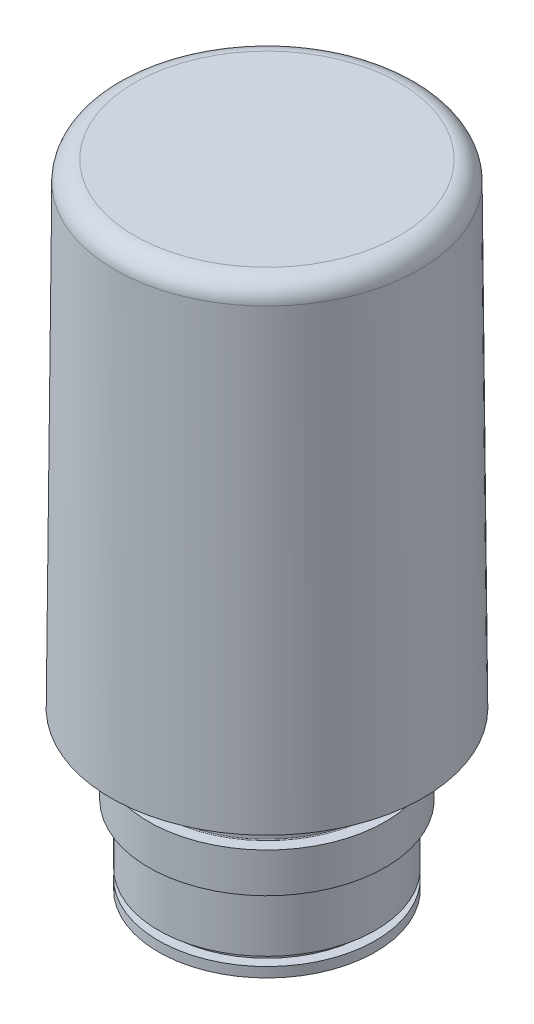
ISO-10303-21;
HEADER;
FILE_DESCRIPTION(('STEP AP214'),'2;1');
FILE_NAME('part.step','',(''),(''),'','','');
FILE_SCHEMA(('AUTOMOTIVE_DESIGN { 1 0 10303 214 1 1 1 1 }'));
ENDSEC;
DATA;
#1=APPLICATION_CONTEXT('core data for automotive mechanical design processes');
#2=APPLICATION_PROTOCOL_DEFINITION('international standard','automotive_design',2000,#1);
#3=PRODUCT_CONTEXT('',#1,'mechanical');
#4=PRODUCT('Part','Part','',(#3));
#5=PRODUCT_RELATED_PRODUCT_CATEGORY('part','',(#4));
#6=PRODUCT_DEFINITION_FORMATION('','',#4);
#7=PRODUCT_DEFINITION_CONTEXT('part definition',#1,'design');
#8=PRODUCT_DEFINITION('design','',#6,#7);
#9=PRODUCT_DEFINITION_SHAPE('','',#8);
#10=(LENGTH_UNIT() NAMED_UNIT(*) SI_UNIT(.MILLI.,.METRE.));
#11=(NAMED_UNIT(*) PLANE_ANGLE_UNIT() SI_UNIT($,.RADIAN.));
#12=(NAMED_UNIT(*) SI_UNIT($,.STERADIAN.) SOLID_ANGLE_UNIT());
#13=UNCERTAINTY_MEASURE_WITH_UNIT(LENGTH_MEASURE(1.E-05),#10,'distance_accuracy_value','');
#14=(GEOMETRIC_REPRESENTATION_CONTEXT(3) GLOBAL_UNCERTAINTY_ASSIGNED_CONTEXT((#13)) GLOBAL_UNIT_ASSIGNED_CONTEXT((#10,
#11,#12)) REPRESENTATION_CONTEXT('',''));
#15=CARTESIAN_POINT('',(0.,0.,0.));
#16=DIRECTION('',(0.,0.,1.));
#17=DIRECTION('',(1.,0.,0.));
#18=AXIS2_PLACEMENT_3D('',#15,#16,#17);
#19=CARTESIAN_POINT('',(0.,0.,0.));
#20=DIRECTION('',(0.,-1.,0.));
#21=DIRECTION('',(0.,0.,-1.));
#22=AXIS2_PLACEMENT_3D('',#19,#20,#21);
#23=CYLINDRICAL_SURFACE('',#22,13.97);
#24=CARTESIAN_POINT('',(0.,36.6349026,0.));
#25=DIRECTION('',(0.,-1.,0.));
#26=DIRECTION('',(0.,0.,-1.));
#27=AXIS2_PLACEMENT_3D('',#24,#25,#26);
#28=CIRCLE('',#27,13.97);
#29=CARTESIAN_POINT('',(0.,36.6349026,-13.97));
#30=VERTEX_POINT('',#29);
#31=EDGE_CURVE('E126',#30,#30,#28,.T.);
#32=ORIENTED_EDGE('',*,*,#31,.F.);
#33=EDGE_LOOP('',(#32));
#34=FACE_BOUND('',#33,.T.);
#35=CARTESIAN_POINT('',(0.,0.,0.));
#36=DIRECTION('',(0.,-1.,0.));
#37=DIRECTION('',(0.,0.,-1.));
#38=AXIS2_PLACEMENT_3D('',#35,#36,#37);
#39=CIRCLE('',#38,13.97);
#40=CARTESIAN_POINT('',(0.,0.,-13.97));
#41=VERTEX_POINT('',#40);
#42=EDGE_CURVE('E69',#41,#41,#39,.T.);
#43=ORIENTED_EDGE('',*,*,#42,.T.);
#44=EDGE_LOOP('',(#43));
#45=FACE_BOUND('',#44,.T.);
#46=ADVANCED_FACE('F37',(#34,#45),#23,.F.);
#47=CARTESIAN_POINT('',(-13.97,0.,0.));
#48=DIRECTION('',(0.,1.,0.));
#49=DIRECTION('',(0.,0.,1.));
#50=AXIS2_PLACEMENT_3D('',#47,#48,#49);
#51=PLANE('',#50);
#52=ORIENTED_EDGE('',*,*,#42,.F.);
#53=EDGE_LOOP('',(#52));
#54=FACE_BOUND('',#53,.T.);
#55=CARTESIAN_POINT('',(0.,0.,0.));
#56=DIRECTION('',(0.,-1.,0.));
#57=DIRECTION('',(0.,0.,-1.));
#58=AXIS2_PLACEMENT_3D('',#55,#56,#57);
#59=CIRCLE('',#58,17.399);
#60=CARTESIAN_POINT('',(0.,0.,-17.399));
#61=VERTEX_POINT('',#60);
#62=EDGE_CURVE('E72',#61,#61,#59,.T.);
#63=ORIENTED_EDGE('',*,*,#62,.T.);
#64=EDGE_LOOP('',(#63));
#65=FACE_BOUND('',#64,.T.);
#66=ADVANCED_FACE('F156',(#54,#65),#51,.F.);
#67=CARTESIAN_POINT('',(0.,0.,0.));
#68=DIRECTION('',(0.,-1.,0.));
#69=DIRECTION('',(0.,0.,-1.));
#70=AXIS2_PLACEMENT_3D('',#67,#68,#69);
#71=CYLINDRICAL_SURFACE('',#70,17.399);
#72=ORIENTED_EDGE('',*,*,#62,.F.);
#73=EDGE_LOOP('',(#72));
#74=FACE_BOUND('',#73,.T.);
#75=CARTESIAN_POINT('',(0.,1.5875,0.));
#76=DIRECTION('',(0.,-1.,0.));
#77=DIRECTION('',(0.,0.,-1.));
#78=AXIS2_PLACEMENT_3D('',#75,#76,#77);
#79=CIRCLE('',#78,17.399);
#80=CARTESIAN_POINT('',(0.,1.5875,-17.399));
#81=VERTEX_POINT('',#80);
#82=EDGE_CURVE('E75',#81,#81,#79,.T.);
#83=ORIENTED_EDGE('',*,*,#82,.T.);
#84=EDGE_LOOP('',(#83));
#85=FACE_BOUND('',#84,.T.);
#86=ADVANCED_FACE('F162',(#74,#85),#71,.T.);
#87=CARTESIAN_POINT('',(-17.399,1.5875,0.));
#88=DIRECTION('',(0.,-1.,0.));
#89=DIRECTION('',(0.,0.,-1.));
#90=AXIS2_PLACEMENT_3D('',#87,#88,#89);
#91=PLANE('',#90);
#92=ORIENTED_EDGE('',*,*,#82,.F.);
#93=EDGE_LOOP('',(#92));
#94=FACE_BOUND('',#93,.T.);
#95=CARTESIAN_POINT('',(0.,1.5875,0.));
#96=DIRECTION('',(0.,-1.,0.));
#97=DIRECTION('',(0.,0.,-1.));
#98=AXIS2_PLACEMENT_3D('',#95,#96,#97);
#99=CIRCLE('',#98,15.7607);
#100=CARTESIAN_POINT('',(0.,1.5875,-15.7607));
#101=VERTEX_POINT('',#100);
#102=EDGE_CURVE('E78',#101,#101,#99,.T.);
#103=ORIENTED_EDGE('',*,*,#102,.T.);
#104=EDGE_LOOP('',(#103));
#105=FACE_BOUND('',#104,.T.);
#106=ADVANCED_FACE('F213',(#94,#105),#91,.F.);
#107=CARTESIAN_POINT('',(0.,0.,0.));
#108=DIRECTION('',(0.,-1.,0.));
#109=DIRECTION('',(0.,0.,-1.));
#110=AXIS2_PLACEMENT_3D('',#107,#108,#109);
#111=CYLINDRICAL_SURFACE('',#110,15.7607);
#112=ORIENTED_EDGE('',*,*,#102,.F.);
#113=EDGE_LOOP('',(#112));
#114=FACE_BOUND('',#113,.T.);
#115=CARTESIAN_POINT('',(0.,3.0099,0.));
#116=DIRECTION('',(0.,-1.,0.));
#117=DIRECTION('',(0.,0.,-1.));
#118=AXIS2_PLACEMENT_3D('',#115,#116,#117);
#119=CIRCLE('',#118,15.7607);
#120=CARTESIAN_POINT('',(0.,3.0099,-15.7607));
#121=VERTEX_POINT('',#120);
#122=EDGE_CURVE('E81',#121,#121,#119,.T.);
#123=ORIENTED_EDGE('',*,*,#122,.T.);
#124=EDGE_LOOP('',(#123));
#125=FACE_BOUND('',#124,.T.);
#126=ADVANCED_FACE('F209',(#114,#125),#111,.T.);
#127=CARTESIAN_POINT('',(-15.7607,3.0099,0.));
#128=DIRECTION('',(0.,1.,0.));
#129=DIRECTION('',(0.,0.,1.));
#130=AXIS2_PLACEMENT_3D('',#127,#128,#129);
#131=PLANE('',#130);
#132=ORIENTED_EDGE('',*,*,#122,.F.);
#133=EDGE_LOOP('',(#132));
#134=FACE_BOUND('',#133,.T.);
#135=CARTESIAN_POINT('',(0.,3.0099,0.));
#136=DIRECTION('',(0.,-1.,0.));
#137=DIRECTION('',(0.,0.,-1.));
#138=AXIS2_PLACEMENT_3D('',#135,#136,#137);
#139=CIRCLE('',#138,17.399);
#140=CARTESIAN_POINT('',(0.,3.0099,-17.399));
#141=VERTEX_POINT('',#140);
#142=EDGE_CURVE('E84',#141,#141,#139,.T.);
#143=ORIENTED_EDGE('',*,*,#142,.T.);
#144=EDGE_LOOP('',(#143));
#145=FACE_BOUND('',#144,.T.);
#146=ADVANCED_FACE('F205',(#134,#145),#131,.F.);
#147=CARTESIAN_POINT('',(0.,0.,0.));
#148=DIRECTION('',(0.,-1.,0.));
#149=DIRECTION('',(0.,0.,-1.));
#150=AXIS2_PLACEMENT_3D('',#147,#148,#149);
#151=CYLINDRICAL_SURFACE('',#150,17.399);
#152=ORIENTED_EDGE('',*,*,#142,.F.);
#153=EDGE_LOOP('',(#152));
#154=FACE_BOUND('',#153,.T.);
#155=CARTESIAN_POINT('',(0.,12.5349,0.));
#156=DIRECTION('',(0.,-1.,0.));
#157=DIRECTION('',(0.,0.,-1.));
#158=AXIS2_PLACEMENT_3D('',#155,#156,#157);
#159=CIRCLE('',#158,17.399);
#160=CARTESIAN_POINT('',(0.,12.5349,-17.399));
#161=VERTEX_POINT('',#160);
#162=EDGE_CURVE('E87',#161,#161,#159,.T.);
#163=ORIENTED_EDGE('',*,*,#162,.T.);
#164=EDGE_LOOP('',(#163));
#165=FACE_BOUND('',#164,.T.);
#166=ADVANCED_FACE('F197',(#154,#165),#151,.T.);
#167=CARTESIAN_POINT('',(-17.399,12.5349,0.));
#168=DIRECTION('',(0.,1.,0.));
#169=DIRECTION('',(0.,0.,1.));
#170=AXIS2_PLACEMENT_3D('',#167,#168,#169);
#171=PLANE('',#170);
#172=ORIENTED_EDGE('',*,*,#162,.F.);
#173=EDGE_LOOP('',(#172));
#174=FACE_BOUND('',#173,.T.);
#175=CARTESIAN_POINT('',(0.,12.5349,0.));
#176=DIRECTION('',(0.,-1.,0.));
#177=DIRECTION('',(0.,0.,-1.));
#178=AXIS2_PLACEMENT_3D('',#175,#176,#177);
#179=CIRCLE('',#178,18.9738);
#180=CARTESIAN_POINT('',(0.,12.5349,-18.9738));
#181=VERTEX_POINT('',#180);
#182=EDGE_CURVE('E90',#181,#181,#179,.T.);
#183=ORIENTED_EDGE('',*,*,#182,.T.);
#184=EDGE_LOOP('',(#183));
#185=FACE_BOUND('',#184,.T.);
#186=ADVANCED_FACE('F191',(#174,#185),#171,.F.);
#187=CARTESIAN_POINT('',(0.,0.,0.));
#188=DIRECTION('',(0.,-1.,0.));
#189=DIRECTION('',(0.,0.,-1.));
#190=AXIS2_PLACEMENT_3D('',#187,#188,#189);
#191=CYLINDRICAL_SURFACE('',#190,18.9738);
#192=ORIENTED_EDGE('',*,*,#182,.F.);
#193=EDGE_LOOP('',(#192));
#194=FACE_BOUND('',#193,.T.);
#195=CARTESIAN_POINT('',(0.,18.8849,0.));
#196=DIRECTION('',(0.,-1.,0.));
#197=DIRECTION('',(0.,0.,-1.));
#198=AXIS2_PLACEMENT_3D('',#195,#196,#197);
#199=CIRCLE('',#198,18.9738);
#200=CARTESIAN_POINT('',(0.,18.8849,-18.9738));
#201=VERTEX_POINT('',#200);
#202=EDGE_CURVE('E93',#201,#201,#199,.T.);
#203=ORIENTED_EDGE('',*,*,#202,.T.);
#204=EDGE_LOOP('',(#203));
#205=FACE_BOUND('',#204,.T.);
#206=ADVANCED_FACE('F186',(#194,#205),#191,.T.);
#207=CARTESIAN_POINT('',(-18.9738,18.8849,0.));
#208=DIRECTION('',(0.,-1.,0.));
#209=DIRECTION('',(0.,0.,-1.));
#210=AXIS2_PLACEMENT_3D('',#207,#208,#209);
#211=PLANE('',#210);
#212=CARTESIAN_POINT('',(0.,18.8849,0.));
#213=DIRECTION('',(0.,-1.,0.));
#214=DIRECTION('',(0.,0.,-1.));
#215=AXIS2_PLACEMENT_3D('',#212,#213,#214);
#216=CIRCLE('',#215,17.145);
#217=CARTESIAN_POINT('',(0.,18.8849,-17.145));
#218=VERTEX_POINT('',#217);
#219=EDGE_CURVE('E60',#218,#218,#216,.T.);
#220=ORIENTED_EDGE('',*,*,#219,.T.);
#221=EDGE_LOOP('',(#220));
#222=FACE_BOUND('',#221,.T.);
#223=ORIENTED_EDGE('',*,*,#202,.F.);
#224=EDGE_LOOP('',(#223));
#225=FACE_BOUND('',#224,.T.);
#226=ADVANCED_FACE('F182',(#222,#225),#211,.F.);
#227=CARTESIAN_POINT('',(0.,0.,0.));
#228=DIRECTION('',(0.,-1.,0.));
#229=DIRECTION('',(0.,0.,-1.));
#230=AXIS2_PLACEMENT_3D('',#227,#228,#229);
#231=CYLINDRICAL_SURFACE('',#230,17.018);
#232=CARTESIAN_POINT('',(0.,19.0119,0.));
#233=DIRECTION('',(0.,-1.,0.));
#234=DIRECTION('',(0.,0.,-1.));
#235=AXIS2_PLACEMENT_3D('',#232,#233,#234);
#236=CIRCLE('',#235,17.018);
#237=CARTESIAN_POINT('',(0.,19.0119,-17.018));
#238=VERTEX_POINT('',#237);
#239=EDGE_CURVE('E52',#238,#238,#236,.F.);
#240=ORIENTED_EDGE('',*,*,#239,.T.);
#241=EDGE_LOOP('',(#240));
#242=FACE_BOUND('',#241,.T.);
#243=CARTESIAN_POINT('',(0.,22.3139,0.));
#244=DIRECTION('',(0.,1.,0.));
#245=DIRECTION('',(0.,0.,1.));
#246=AXIS2_PLACEMENT_3D('',#243,#244,#245);
#247=CIRCLE('',#246,17.018);
#248=CARTESIAN_POINT('',(0.,22.3139,17.018));
#249=VERTEX_POINT('',#248);
#250=EDGE_CURVE('E57',#249,#249,#247,.F.);
#251=ORIENTED_EDGE('',*,*,#250,.T.);
#252=EDGE_LOOP('',(#251));
#253=FACE_BOUND('',#252,.T.);
#254=ADVANCED_FACE('F185',(#242,#253),#231,.T.);
#255=CARTESIAN_POINT('',(-17.018,22.4409,0.));
#256=DIRECTION('',(0.,1.,0.));
#257=DIRECTION('',(0.,0.,1.));
#258=AXIS2_PLACEMENT_3D('',#255,#256,#257);
#259=PLANE('',#258);
#260=CARTESIAN_POINT('',(0.,22.4409,0.));
#261=DIRECTION('',(0.,1.,0.));
#262=DIRECTION('',(0.,0.,1.));
#263=AXIS2_PLACEMENT_3D('',#260,#261,#262);
#264=CIRCLE('',#263,17.145);
#265=CARTESIAN_POINT('',(0.,22.4409,17.145));
#266=VERTEX_POINT('',#265);
#267=EDGE_CURVE('E48',#266,#266,#264,.T.);
#268=ORIENTED_EDGE('',*,*,#267,.T.);
#269=EDGE_LOOP('',(#268));
#270=FACE_BOUND('',#269,.T.);
#271=CARTESIAN_POINT('',(0.,22.4409,0.));
#272=DIRECTION('',(0.,-1.,0.));
#273=DIRECTION('',(0.,0.,-1.));
#274=AXIS2_PLACEMENT_3D('',#271,#272,#273);
#275=CIRCLE('',#274,18.9738);
#276=CARTESIAN_POINT('',(0.,22.4409,-18.9738));
#277=VERTEX_POINT('',#276);
#278=EDGE_CURVE('E96',#277,#277,#275,.T.);
#279=ORIENTED_EDGE('',*,*,#278,.T.);
#280=EDGE_LOOP('',(#279));
#281=FACE_BOUND('',#280,.T.);
#282=ADVANCED_FACE('F271',(#270,#281),#259,.F.);
#283=CARTESIAN_POINT('',(0.,0.,0.));
#284=DIRECTION('',(0.,-1.,0.));
#285=DIRECTION('',(0.,0.,-1.));
#286=AXIS2_PLACEMENT_3D('',#283,#284,#285);
#287=CYLINDRICAL_SURFACE('',#286,18.9738);
#288=ORIENTED_EDGE('',*,*,#278,.F.);
#289=EDGE_LOOP('',(#288));
#290=FACE_BOUND('',#289,.T.);
#291=CARTESIAN_POINT('',(0.,25.2349,0.));
#292=DIRECTION('',(0.,-1.,0.));
#293=DIRECTION('',(0.,0.,-1.));
#294=AXIS2_PLACEMENT_3D('',#291,#292,#293);
#295=CIRCLE('',#294,18.9738);
#296=CARTESIAN_POINT('',(0.,25.2349,-18.9738));
#297=VERTEX_POINT('',#296);
#298=EDGE_CURVE('E132',#297,#297,#295,.T.);
#299=ORIENTED_EDGE('',*,*,#298,.T.);
#300=EDGE_LOOP('',(#299));
#301=FACE_BOUND('',#300,.T.);
#302=ADVANCED_FACE('F136',(#290,#301),#287,.T.);
#303=CARTESIAN_POINT('',(0.,96.3549,0.));
#304=DIRECTION('',(0.,1.,0.));
#305=DIRECTION('',(0.,0.,1.));
#306=AXIS2_PLACEMENT_3D('',#303,#304,#305);
#307=PLANE('',#306);
#308=CARTESIAN_POINT('',(0.,96.3549,0.));
#309=DIRECTION('',(0.,1.,0.));
#310=DIRECTION('',(0.,0.,1.));
#311=AXIS2_PLACEMENT_3D('',#308,#309,#310);
#312=CIRCLE('',#311,9.55258690636094);
#313=CARTESIAN_POINT('',(0.,96.3549,9.55258690636094));
#314=VERTEX_POINT('',#313);
#315=EDGE_CURVE('E66',#314,#314,#312,.F.);
#316=ORIENTED_EDGE('',*,*,#315,.T.);
#317=EDGE_LOOP('',(#316));
#318=FACE_BOUND('',#317,.T.);
#319=ADVANCED_FACE('F270',(#318),#307,.F.);
#320=CARTESIAN_POINT('',(0.,60.8469,0.));
#321=DIRECTION('',(0.,-1.,0.));
#322=DIRECTION('',(0.,0.,-1.));
#323=AXIS2_PLACEMENT_3D('',#320,#321,#322);
#324=CONICAL_SURFACE('',#323,13.0098736215143,0.00872664625997153);
#325=CARTESIAN_POINT('',(0.,93.2076067502073,0.));
#326=DIRECTION('',(0.,-1.,0.));
#327=DIRECTION('',(0.,0.,-1.));
#328=AXIS2_PLACEMENT_3D('',#325,#326,#327);
#329=CIRCLE('',#328,12.7274660120897);
#330=CARTESIAN_POINT('',(0.,93.2076067502073,-12.7274660120897));
#331=VERTEX_POINT('',#330);
#332=EDGE_CURVE('E63',#331,#331,#329,.F.);
#333=ORIENTED_EDGE('',*,*,#332,.T.);
#334=EDGE_LOOP('',(#333));
#335=FACE_BOUND('',#334,.T.);
#336=CARTESIAN_POINT('',(0.,60.8469,0.));
#337=DIRECTION('',(0.,-1.,0.));
#338=DIRECTION('',(0.,0.,-1.));
#339=AXIS2_PLACEMENT_3D('',#336,#337,#338);
#340=CIRCLE('',#339,13.0098736215143);
#341=CARTESIAN_POINT('',(0.,60.8469,-13.0098736215143));
#342=VERTEX_POINT('',#341);
#343=EDGE_CURVE('E99',#342,#342,#340,.T.);
#344=ORIENTED_EDGE('',*,*,#343,.T.);
#345=EDGE_LOOP('',(#344));
#346=FACE_BOUND('',#345,.T.);
#347=ADVANCED_FACE('F287',(#335,#346),#324,.F.);
#348=CARTESIAN_POINT('',(-13.0098736215143,60.8469,0.));
#349=DIRECTION('',(0.,1.,0.));
#350=DIRECTION('',(0.,0.,1.));
#351=AXIS2_PLACEMENT_3D('',#348,#349,#350);
#352=PLANE('',#351);
#353=ORIENTED_EDGE('',*,*,#343,.F.);
#354=EDGE_LOOP('',(#353));
#355=FACE_BOUND('',#354,.T.);
#356=CARTESIAN_POINT('',(0.,60.8469,0.));
#357=DIRECTION('',(0.,-1.,0.));
#358=DIRECTION('',(0.,0.,-1.));
#359=AXIS2_PLACEMENT_3D('',#356,#357,#358);
#360=CIRCLE('',#359,13.97);
#361=CARTESIAN_POINT('',(0.,60.8469,-13.97));
#362=VERTEX_POINT('',#361);
#363=EDGE_CURVE('E102',#362,#362,#360,.T.);
#364=ORIENTED_EDGE('',*,*,#363,.T.);
#365=EDGE_LOOP('',(#364));
#366=FACE_BOUND('',#365,.T.);
#367=ADVANCED_FACE('F281',(#355,#366),#352,.F.);
#368=CARTESIAN_POINT('',(0.,0.,0.));
#369=DIRECTION('',(0.,-1.,0.));
#370=DIRECTION('',(0.,0.,-1.));
#371=AXIS2_PLACEMENT_3D('',#368,#369,#370);
#372=CYLINDRICAL_SURFACE('',#371,13.97);
#373=ORIENTED_EDGE('',*,*,#363,.F.);
#374=EDGE_LOOP('',(#373));
#375=FACE_BOUND('',#374,.T.);
#376=CARTESIAN_POINT('',(0.,60.0269,0.));
#377=DIRECTION('',(0.,-1.,0.));
#378=DIRECTION('',(0.,0.,-1.));
#379=AXIS2_PLACEMENT_3D('',#376,#377,#378);
#380=CIRCLE('',#379,13.97);
#381=CARTESIAN_POINT('',(0.,60.0269,-13.97));
#382=VERTEX_POINT('',#381);
#383=EDGE_CURVE('E105',#382,#382,#380,.T.);
#384=ORIENTED_EDGE('',*,*,#383,.T.);
#385=EDGE_LOOP('',(#384));
#386=FACE_BOUND('',#385,.T.);
#387=ADVANCED_FACE('F286',(#375,#386),#372,.F.);
#388=CARTESIAN_POINT('',(-13.97,60.0269,0.));
#389=DIRECTION('',(0.,1.,0.));
#390=DIRECTION('',(0.,0.,1.));
#391=AXIS2_PLACEMENT_3D('',#388,#389,#390);
#392=PLANE('',#391);
#393=ORIENTED_EDGE('',*,*,#383,.F.);
#394=EDGE_LOOP('',(#393));
#395=FACE_BOUND('',#394,.T.);
#396=CARTESIAN_POINT('',(0.,60.0269,0.));
#397=DIRECTION('',(0.,-1.,0.));
#398=DIRECTION('',(0.,0.,-1.));
#399=AXIS2_PLACEMENT_3D('',#396,#397,#398);
#400=CIRCLE('',#399,14.7);
#401=CARTESIAN_POINT('',(0.,60.0269,-14.7));
#402=VERTEX_POINT('',#401);
#403=EDGE_CURVE('E108',#402,#402,#400,.T.);
#404=ORIENTED_EDGE('',*,*,#403,.T.);
#405=EDGE_LOOP('',(#404));
#406=FACE_BOUND('',#405,.T.);
#407=ADVANCED_FACE('F299',(#395,#406),#392,.F.);
#408=CARTESIAN_POINT('',(0.,0.,0.));
#409=DIRECTION('',(0.,-1.,0.));
#410=DIRECTION('',(0.,0.,-1.));
#411=AXIS2_PLACEMENT_3D('',#408,#409,#410);
#412=CYLINDRICAL_SURFACE('',#411,14.7);
#413=ORIENTED_EDGE('',*,*,#403,.F.);
#414=EDGE_LOOP('',(#413));
#415=FACE_BOUND('',#414,.T.);
#416=CARTESIAN_POINT('',(0.,58.7269026,0.));
#417=DIRECTION('',(0.,-1.,0.));
#418=DIRECTION('',(0.,0.,-1.));
#419=AXIS2_PLACEMENT_3D('',#416,#417,#418);
#420=CIRCLE('',#419,14.7);
#421=CARTESIAN_POINT('',(0.,58.7269026,-14.7));
#422=VERTEX_POINT('',#421);
#423=EDGE_CURVE('E111',#422,#422,#420,.T.);
#424=ORIENTED_EDGE('',*,*,#423,.T.);
#425=EDGE_LOOP('',(#424));
#426=FACE_BOUND('',#425,.T.);
#427=ADVANCED_FACE('F309',(#415,#426),#412,.F.);
#428=CARTESIAN_POINT('',(-14.7,58.7269026,0.));
#429=DIRECTION('',(0.,-1.,0.));
#430=DIRECTION('',(0.,0.,-1.));
#431=AXIS2_PLACEMENT_3D('',#428,#429,#430);
#432=PLANE('',#431);
#433=ORIENTED_EDGE('',*,*,#423,.F.);
#434=EDGE_LOOP('',(#433));
#435=FACE_BOUND('',#434,.T.);
#436=CARTESIAN_POINT('',(0.,58.7269026,0.));
#437=DIRECTION('',(0.,-1.,0.));
#438=DIRECTION('',(0.,0.,-1.));
#439=AXIS2_PLACEMENT_3D('',#436,#437,#438);
#440=CIRCLE('',#439,13.97);
#441=CARTESIAN_POINT('',(0.,58.7269026,-13.97));
#442=VERTEX_POINT('',#441);
#443=EDGE_CURVE('E114',#442,#442,#440,.T.);
#444=ORIENTED_EDGE('',*,*,#443,.T.);
#445=EDGE_LOOP('',(#444));
#446=FACE_BOUND('',#445,.T.);
#447=ADVANCED_FACE('F319',(#435,#446),#432,.F.);
#448=CARTESIAN_POINT('',(0.,0.,0.));
#449=DIRECTION('',(0.,-1.,0.));
#450=DIRECTION('',(0.,0.,-1.));
#451=AXIS2_PLACEMENT_3D('',#448,#449,#450);
#452=CYLINDRICAL_SURFACE('',#451,13.97);
#453=ORIENTED_EDGE('',*,*,#443,.F.);
#454=EDGE_LOOP('',(#453));
#455=FACE_BOUND('',#454,.T.);
#456=CARTESIAN_POINT('',(0.,37.9349,0.));
#457=DIRECTION('',(0.,-1.,0.));
#458=DIRECTION('',(0.,0.,-1.));
#459=AXIS2_PLACEMENT_3D('',#456,#457,#458);
#460=CIRCLE('',#459,13.97);
#461=CARTESIAN_POINT('',(0.,37.9349,-13.97));
#462=VERTEX_POINT('',#461);
#463=EDGE_CURVE('E117',#462,#462,#460,.T.);
#464=ORIENTED_EDGE('',*,*,#463,.T.);
#465=EDGE_LOOP('',(#464));
#466=FACE_BOUND('',#465,.T.);
#467=ADVANCED_FACE('F329',(#455,#466),#452,.F.);
#468=CARTESIAN_POINT('',(-13.97,37.9349,0.));
#469=DIRECTION('',(0.,1.,0.));
#470=DIRECTION('',(0.,0.,1.));
#471=AXIS2_PLACEMENT_3D('',#468,#469,#470);
#472=PLANE('',#471);
#473=ORIENTED_EDGE('',*,*,#463,.F.);
#474=EDGE_LOOP('',(#473));
#475=FACE_BOUND('',#474,.T.);
#476=CARTESIAN_POINT('',(0.,37.9349,0.));
#477=DIRECTION('',(0.,-1.,0.));
#478=DIRECTION('',(0.,0.,-1.));
#479=AXIS2_PLACEMENT_3D('',#476,#477,#478);
#480=CIRCLE('',#479,14.7);
#481=CARTESIAN_POINT('',(0.,37.9349,-14.7));
#482=VERTEX_POINT('',#481);
#483=EDGE_CURVE('E120',#482,#482,#480,.T.);
#484=ORIENTED_EDGE('',*,*,#483,.T.);
#485=EDGE_LOOP('',(#484));
#486=FACE_BOUND('',#485,.T.);
#487=ADVANCED_FACE('F339',(#475,#486),#472,.F.);
#488=CARTESIAN_POINT('',(0.,0.,0.));
#489=DIRECTION('',(0.,-1.,0.));
#490=DIRECTION('',(0.,0.,-1.));
#491=AXIS2_PLACEMENT_3D('',#488,#489,#490);
#492=CYLINDRICAL_SURFACE('',#491,14.7);
#493=ORIENTED_EDGE('',*,*,#483,.F.);
#494=EDGE_LOOP('',(#493));
#495=FACE_BOUND('',#494,.T.);
#496=CARTESIAN_POINT('',(0.,36.6349026,0.));
#497=DIRECTION('',(0.,-1.,0.));
#498=DIRECTION('',(0.,0.,-1.));
#499=AXIS2_PLACEMENT_3D('',#496,#497,#498);
#500=CIRCLE('',#499,14.7);
#501=CARTESIAN_POINT('',(0.,36.6349026,-14.7));
#502=VERTEX_POINT('',#501);
#503=EDGE_CURVE('E123',#502,#502,#500,.T.);
#504=ORIENTED_EDGE('',*,*,#503,.T.);
#505=EDGE_LOOP('',(#504));
#506=FACE_BOUND('',#505,.T.);
#507=ADVANCED_FACE('F349',(#495,#506),#492,.F.);
#508=CARTESIAN_POINT('',(-14.7,36.6349026,0.));
#509=DIRECTION('',(0.,-1.,0.));
#510=DIRECTION('',(0.,0.,-1.));
#511=AXIS2_PLACEMENT_3D('',#508,#509,#510);
#512=PLANE('',#511);
#513=ORIENTED_EDGE('',*,*,#503,.F.);
#514=EDGE_LOOP('',(#513));
#515=FACE_BOUND('',#514,.T.);
#516=ORIENTED_EDGE('',*,*,#31,.T.);
#517=EDGE_LOOP('',(#516));
#518=FACE_BOUND('',#517,.T.);
#519=ADVANCED_FACE('F172',(#515,#518),#512,.F.);
#520=CARTESIAN_POINT('',(0.,93.1799,0.));
#521=DIRECTION('',(0.,1.,0.));
#522=DIRECTION('',(0.,0.,1.));
#523=AXIS2_PLACEMENT_3D('',#520,#521,#522);
#524=TOROIDAL_SURFACE('',#523,9.55258690636094,3.175);
#525=ORIENTED_EDGE('',*,*,#332,.F.);
#526=EDGE_LOOP('',(#525));
#527=FACE_BOUND('',#526,.T.);
#528=ORIENTED_EDGE('',*,*,#315,.F.);
#529=EDGE_LOOP('',(#528));
#530=FACE_BOUND('',#529,.T.);
#531=ADVANCED_FACE('F169',(#527,#530),#524,.F.);
#532=CARTESIAN_POINT('',(0.,19.0119,0.));
#533=DIRECTION('',(0.,-1.,0.));
#534=DIRECTION('',(0.,0.,-1.));
#535=AXIS2_PLACEMENT_3D('',#532,#533,#534);
#536=TOROIDAL_SURFACE('',#535,17.145,0.127);
#537=ORIENTED_EDGE('',*,*,#239,.F.);
#538=EDGE_LOOP('',(#537));
#539=FACE_BOUND('',#538,.T.);
#540=ORIENTED_EDGE('',*,*,#219,.F.);
#541=EDGE_LOOP('',(#540));
#542=FACE_BOUND('',#541,.T.);
#543=ADVANCED_FACE('F152',(#539,#542),#536,.F.);
#544=CARTESIAN_POINT('',(0.,22.3139,0.));
#545=DIRECTION('',(0.,1.,0.));
#546=DIRECTION('',(0.,0.,1.));
#547=AXIS2_PLACEMENT_3D('',#544,#545,#546);
#548=TOROIDAL_SURFACE('',#547,17.145,0.127);
#549=ORIENTED_EDGE('',*,*,#267,.F.);
#550=EDGE_LOOP('',(#549));
#551=FACE_BOUND('',#550,.T.);
#552=ORIENTED_EDGE('',*,*,#250,.F.);
#553=EDGE_LOOP('',(#552));
#554=FACE_BOUND('',#553,.T.);
#555=ADVANCED_FACE('F147',(#551,#554),#548,.F.);
#556=CARTESIAN_POINT('',(0.,101.4349,0.));
#557=DIRECTION('',(0.,-1.,0.));
#558=DIRECTION('',(0.,0.,-1.));
#559=AXIS2_PLACEMENT_3D('',#556,#557,#558);
#560=CONICAL_SURFACE('',#559,24.3870198806754,0.00872664625997166);
#561=CARTESIAN_POINT('',(0.,98.287606750207,0.));
#562=DIRECTION('',(0.,1.,0.));
#563=DIRECTION('',(0.,0.,1.));
#564=AXIS2_PLACEMENT_3D('',#561,#562,#563);
#565=CIRCLE('',#564,24.4144858927651);
#566=CARTESIAN_POINT('',(0.,98.287606750207,24.4144858927651));
#567=VERTEX_POINT('',#566);
#568=EDGE_CURVE('E44',#567,#567,#565,.F.);
#569=ORIENTED_EDGE('',*,*,#568,.T.);
#570=EDGE_LOOP('',(#569));
#571=FACE_BOUND('',#570,.T.);
#572=CARTESIAN_POINT('',(0.,25.2349,0.));
#573=DIRECTION('',(0.,-1.,0.));
#574=DIRECTION('',(0.,0.,-1.));
#575=AXIS2_PLACEMENT_3D('',#572,#573,#574);
#576=CIRCLE('',#575,25.0520072063312);
#577=CARTESIAN_POINT('',(0.,25.2349,-25.0520072063312));
#578=VERTEX_POINT('',#577);
#579=EDGE_CURVE('E129',#578,#578,#576,.T.);
#580=ORIENTED_EDGE('',*,*,#579,.F.);
#581=EDGE_LOOP('',(#580));
#582=FACE_BOUND('',#581,.T.);
#583=ADVANCED_FACE('F142',(#571,#582),#560,.T.);
#584=CARTESIAN_POINT('',(-25.0520072063312,25.2349,0.));
#585=DIRECTION('',(0.,1.,0.));
#586=DIRECTION('',(0.,0.,1.));
#587=AXIS2_PLACEMENT_3D('',#584,#585,#586);
#588=PLANE('',#587);
#589=ORIENTED_EDGE('',*,*,#298,.F.);
#590=EDGE_LOOP('',(#589));
#591=FACE_BOUND('',#590,.T.);
#592=ORIENTED_EDGE('',*,*,#579,.T.);
#593=EDGE_LOOP('',(#592));
#594=FACE_BOUND('',#593,.T.);
#595=ADVANCED_FACE('F138',(#591,#594),#588,.F.);
#596=CARTESIAN_POINT('',(-18.3088126743442,101.4349,0.));
#597=DIRECTION('',(0.,-1.,0.));
#598=DIRECTION('',(0.,0.,-1.));
#599=AXIS2_PLACEMENT_3D('',#596,#597,#598);
#600=PLANE('',#599);
#601=CARTESIAN_POINT('',(0.,101.4349,0.));
#602=DIRECTION('',(0.,-1.,0.));
#603=DIRECTION('',(0.,0.,-1.));
#604=AXIS2_PLACEMENT_3D('',#601,#602,#603);
#605=CIRCLE('',#604,21.2396067870363);
#606=CARTESIAN_POINT('',(0.,101.4349,-21.2396067870363));
#607=VERTEX_POINT('',#606);
#608=EDGE_CURVE('E10',#607,#607,#605,.F.);
#609=ORIENTED_EDGE('',*,*,#608,.T.);
#610=EDGE_LOOP('',(#609));
#611=FACE_BOUND('',#610,.T.);
#612=ADVANCED_FACE('F141',(#611),#600,.F.);
#613=CARTESIAN_POINT('',(0.,98.2599,0.));
#614=DIRECTION('',(0.,-1.,0.));
#615=DIRECTION('',(0.,0.,-1.));
#616=AXIS2_PLACEMENT_3D('',#613,#614,#615);
#617=TOROIDAL_SURFACE('',#616,21.2396067870363,3.175);
#618=ORIENTED_EDGE('',*,*,#608,.F.);
#619=EDGE_LOOP('',(#618));
#620=FACE_BOUND('',#619,.T.);
#621=ORIENTED_EDGE('',*,*,#568,.F.);
#622=EDGE_LOOP('',(#621));
#623=FACE_BOUND('',#622,.T.);
#624=ADVANCED_FACE('F39',(#620,#623),#617,.T.);
#625=CLOSED_SHELL('',(#46,#66,#86,#106,#126,#146,#166,#186,#206,#226,#254,#282,#302,#319,#347,
#367,#387,#407,#427,#447,#467,#487,#507,#519,#531,#543,#555,#583,#595,#612,#624));
#626=MANIFOLD_SOLID_BREP('B2',#625);
#627=ADVANCED_BREP_SHAPE_REPRESENTATION('',(#18,#626),#14);
#628=SHAPE_DEFINITION_REPRESENTATION(#9,#627);
ENDSEC;
END-ISO-10303-21;
